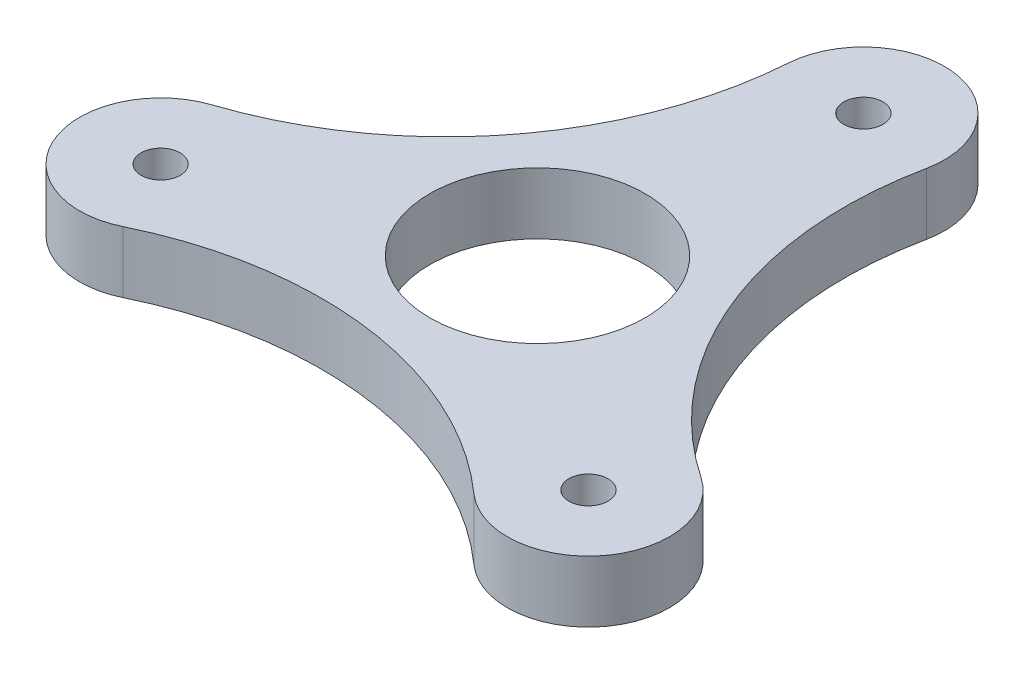
ISO-10303-21;
HEADER;
FILE_DESCRIPTION(('STEP AP214'),'2;1');
FILE_NAME('part.step','',(''),(''),'','','');
FILE_SCHEMA(('AUTOMOTIVE_DESIGN { 1 0 10303 214 1 1 1 1 }'));
ENDSEC;
DATA;
#1=APPLICATION_CONTEXT('core data for automotive mechanical design processes');
#2=APPLICATION_PROTOCOL_DEFINITION('international standard','automotive_design',2000,#1);
#3=PRODUCT_CONTEXT('',#1,'mechanical');
#4=PRODUCT('Part','Part','',(#3));
#5=PRODUCT_RELATED_PRODUCT_CATEGORY('part','',(#4));
#6=PRODUCT_DEFINITION_FORMATION('','',#4);
#7=PRODUCT_DEFINITION_CONTEXT('part definition',#1,'design');
#8=PRODUCT_DEFINITION('design','',#6,#7);
#9=PRODUCT_DEFINITION_SHAPE('','',#8);
#10=(LENGTH_UNIT() NAMED_UNIT(*) SI_UNIT(.MILLI.,.METRE.));
#11=(NAMED_UNIT(*) PLANE_ANGLE_UNIT() SI_UNIT($,.RADIAN.));
#12=(NAMED_UNIT(*) SI_UNIT($,.STERADIAN.) SOLID_ANGLE_UNIT());
#13=UNCERTAINTY_MEASURE_WITH_UNIT(LENGTH_MEASURE(1.E-05),#10,'distance_accuracy_value','');
#14=(GEOMETRIC_REPRESENTATION_CONTEXT(3) GLOBAL_UNCERTAINTY_ASSIGNED_CONTEXT((#13)) GLOBAL_UNIT_ASSIGNED_CONTEXT((#10,
#11,#12)) REPRESENTATION_CONTEXT('',''));
#15=CARTESIAN_POINT('',(0.,0.,0.));
#16=DIRECTION('',(0.,0.,1.));
#17=DIRECTION('',(1.,0.,0.));
#18=AXIS2_PLACEMENT_3D('',#15,#16,#17);
#19=CARTESIAN_POINT('',(493.86235827293,6.35,-1314.24921084591));
#20=DIRECTION('',(0.,1.,0.));
#21=DIRECTION('',(0.,0.,1.));
#22=AXIS2_PLACEMENT_3D('',#19,#20,#21);
#23=PLANE('',#22);
#24=CARTESIAN_POINT('',(536.53601557805,6.35,-1264.7338598442));
#25=DIRECTION('',(0.,1.,0.));
#26=DIRECTION('',(0.,0.,1.));
#27=AXIS2_PLACEMENT_3D('',#24,#25,#26);
#28=CIRCLE('',#27,2.0193000000007);
#29=CARTESIAN_POINT('',(536.53601557805,6.35,-1262.7145598442));
#30=VERTEX_POINT('',#29);
#31=EDGE_CURVE('E189',#30,#30,#28,.T.);
#32=ORIENTED_EDGE('',*,*,#31,.F.);
#33=EDGE_LOOP('',(#32));
#34=FACE_BOUND('',#33,.T.);
#35=CARTESIAN_POINT('',(517.039050419532,6.35,-1312.60911884723));
#36=DIRECTION('',(0.,1.,0.));
#37=DIRECTION('',(0.,0.,1.));
#38=AXIS2_PLACEMENT_3D('',#35,#36,#37);
#39=CIRCLE('',#38,2.01929999999819);
#40=CARTESIAN_POINT('',(517.039050419532,6.35,-1310.58981884723));
#41=VERTEX_POINT('',#40);
#42=EDGE_CURVE('E122',#41,#41,#39,.T.);
#43=ORIENTED_EDGE('',*,*,#42,.F.);
#44=EDGE_LOOP('',(#43));
#45=FACE_BOUND('',#44,.T.);
#46=CARTESIAN_POINT('',(470.685666126328,6.35,-1315.8893028446));
#47=DIRECTION('',(0.,-1.,0.));
#48=DIRECTION('',(0.,0.,1.));
#49=AXIS2_PLACEMENT_3D('',#46,#47,#48);
#50=CIRCLE('',#49,38.1);
#51=CARTESIAN_POINT('',(508.690627285009,6.35,-1313.19989262539));
#52=VERTEX_POINT('',#51);
#53=CARTESIAN_POINT('',(482.689500258394,6.35,-1279.72968495212));
#54=VERTEX_POINT('',#53);
#55=EDGE_CURVE('E129',#52,#54,#50,.T.);
#56=ORIENTED_EDGE('',*,*,#55,.T.);
#57=CARTESIAN_POINT('',(485.326342489404,6.35,-1271.78662222174));
#58=DIRECTION('',(0.,1.,0.));
#59=DIRECTION('',(0.,0.,1.));
#60=AXIS2_PLACEMENT_3D('',#57,#58,#59);
#61=CIRCLE('',#60,8.36930000000019);
#62=CARTESIAN_POINT('',(488.988928956896,6.35,-1264.26128881662));
#63=VERTEX_POINT('',#62);
#64=EDGE_CURVE('E87',#54,#63,#61,.T.);
#65=ORIENTED_EDGE('',*,*,#64,.T.);
#66=CARTESIAN_POINT('',(505.662311965204,6.35,-1230.00332187376));
#67=DIRECTION('',(0.,-1.,0.));
#68=DIRECTION('',(0.,0.,-1.));
#69=AXIS2_PLACEMENT_3D('',#66,#67,#68);
#70=CIRCLE('',#69,38.1);
#71=CARTESIAN_POINT('',(530.975542585193,6.35,-1258.47875612118));
#72=VERTEX_POINT('',#71);
#73=EDGE_CURVE('E100',#63,#72,#70,.T.);
#74=ORIENTED_EDGE('',*,*,#73,.T.);
#75=CARTESIAN_POINT('',(536.53601557805,6.35,-1264.7338598442));
#76=DIRECTION('',(0.,1.,0.));
#77=DIRECTION('',(0.,0.,1.));
#78=AXIS2_PLACEMENT_3D('',#75,#76,#77);
#79=CIRCLE('',#78,8.36929999999969);
#80=CARTESIAN_POINT('',(541.221852245082,6.35,-1271.66841947116));
#81=VERTEX_POINT('',#80);
#82=EDGE_CURVE('E94',#72,#81,#79,.T.);
#83=ORIENTED_EDGE('',*,*,#82,.T.);
#84=CARTESIAN_POINT('',(562.553430395455,6.35,-1303.23697619481));
#85=DIRECTION('',(0.,-1.,0.));
#86=DIRECTION('',(0.,0.,-1.));
#87=AXIS2_PLACEMENT_3D('',#84,#85,#86);
#88=CIRCLE('',#87,38.1);
#89=CARTESIAN_POINT('',(525.2363656434,6.35,-1310.92115983987));
#90=VERTEX_POINT('',#89);
#91=EDGE_CURVE('E98',#81,#90,#88,.T.);
#92=ORIENTED_EDGE('',*,*,#91,.T.);
#93=CARTESIAN_POINT('',(517.039050419532,6.35,-1312.60911884723));
#94=DIRECTION('',(0.,1.,0.));
#95=DIRECTION('',(0.,0.,1.));
#96=AXIS2_PLACEMENT_3D('',#93,#94,#95);
#97=CIRCLE('',#96,8.36929999999943);
#98=EDGE_CURVE('E50',#90,#52,#97,.T.);
#99=ORIENTED_EDGE('',*,*,#98,.T.);
#100=EDGE_LOOP('',(#56,#65,#74,#83,#92,#99));
#101=FACE_BOUND('',#100,.T.);
#102=CARTESIAN_POINT('',(512.967136162329,6.35,-1283.04320030439));
#103=DIRECTION('',(0.,1.,0.));
#104=DIRECTION('',(0.,0.,1.));
#105=AXIS2_PLACEMENT_3D('',#102,#103,#104);
#106=CIRCLE('',#105,11.1124999999999);
#107=CARTESIAN_POINT('',(512.967136162329,6.35,-1271.93070030439));
#108=VERTEX_POINT('',#107);
#109=EDGE_CURVE('E195',#108,#108,#106,.T.);
#110=ORIENTED_EDGE('',*,*,#109,.F.);
#111=EDGE_LOOP('',(#110));
#112=FACE_BOUND('',#111,.T.);
#113=CARTESIAN_POINT('',(485.326342489404,6.35,-1271.78662222174));
#114=DIRECTION('',(0.,1.,0.));
#115=DIRECTION('',(0.,0.,1.));
#116=AXIS2_PLACEMENT_3D('',#113,#114,#115);
#117=CIRCLE('',#116,2.01930000000017);
#118=CARTESIAN_POINT('',(485.326342489404,6.35,-1269.76732222174));
#119=VERTEX_POINT('',#118);
#120=EDGE_CURVE('E180',#119,#119,#117,.T.);
#121=ORIENTED_EDGE('',*,*,#120,.F.);
#122=EDGE_LOOP('',(#121));
#123=FACE_BOUND('',#122,.T.);
#124=ADVANCED_FACE('F33',(#34,#45,#101,#112,#123),#23,.T.);
#125=CARTESIAN_POINT('',(493.86235827293,0.,-1314.24921084591));
#126=DIRECTION('',(0.,1.,0.));
#127=DIRECTION('',(0.,0.,1.));
#128=AXIS2_PLACEMENT_3D('',#125,#126,#127);
#129=PLANE('',#128);
#130=CARTESIAN_POINT('',(470.685666126328,0.,-1315.8893028446));
#131=DIRECTION('',(0.,-1.,0.));
#132=DIRECTION('',(0.,0.,1.));
#133=AXIS2_PLACEMENT_3D('',#130,#131,#132);
#134=CIRCLE('',#133,38.1);
#135=CARTESIAN_POINT('',(508.690627285009,0.,-1313.19989262539));
#136=VERTEX_POINT('',#135);
#137=CARTESIAN_POINT('',(482.689500258394,0.,-1279.72968495212));
#138=VERTEX_POINT('',#137);
#139=EDGE_CURVE('E118',#136,#138,#134,.T.);
#140=ORIENTED_EDGE('',*,*,#139,.F.);
#141=CARTESIAN_POINT('',(517.039050419532,0.,-1312.60911884723));
#142=DIRECTION('',(0.,1.,0.));
#143=DIRECTION('',(0.,0.,1.));
#144=AXIS2_PLACEMENT_3D('',#141,#142,#143);
#145=CIRCLE('',#144,8.36929999999943);
#146=CARTESIAN_POINT('',(525.2363656434,0.,-1310.92115983987));
#147=VERTEX_POINT('',#146);
#148=EDGE_CURVE('E79',#147,#136,#145,.T.);
#149=ORIENTED_EDGE('',*,*,#148,.F.);
#150=CARTESIAN_POINT('',(562.553430395455,0.,-1303.23697619481));
#151=DIRECTION('',(0.,-1.,0.));
#152=DIRECTION('',(0.,0.,-1.));
#153=AXIS2_PLACEMENT_3D('',#150,#151,#152);
#154=CIRCLE('',#153,38.1);
#155=CARTESIAN_POINT('',(541.221852245082,0.,-1271.66841947116));
#156=VERTEX_POINT('',#155);
#157=EDGE_CURVE('E73',#156,#147,#154,.T.);
#158=ORIENTED_EDGE('',*,*,#157,.F.);
#159=CARTESIAN_POINT('',(536.53601557805,0.,-1264.7338598442));
#160=DIRECTION('',(0.,1.,0.));
#161=DIRECTION('',(0.,0.,1.));
#162=AXIS2_PLACEMENT_3D('',#159,#160,#161);
#163=CIRCLE('',#162,8.36929999999969);
#164=CARTESIAN_POINT('',(530.975542585193,0.,-1258.47875612118));
#165=VERTEX_POINT('',#164);
#166=EDGE_CURVE('E108',#165,#156,#163,.T.);
#167=ORIENTED_EDGE('',*,*,#166,.F.);
#168=CARTESIAN_POINT('',(505.662311965204,0.,-1230.00332187376));
#169=DIRECTION('',(0.,-1.,0.));
#170=DIRECTION('',(0.,0.,-1.));
#171=AXIS2_PLACEMENT_3D('',#168,#169,#170);
#172=CIRCLE('',#171,38.1);
#173=CARTESIAN_POINT('',(488.988928956896,0.,-1264.26128881662));
#174=VERTEX_POINT('',#173);
#175=EDGE_CURVE('E124',#174,#165,#172,.T.);
#176=ORIENTED_EDGE('',*,*,#175,.F.);
#177=CARTESIAN_POINT('',(485.326342489404,0.,-1271.78662222174));
#178=DIRECTION('',(0.,1.,0.));
#179=DIRECTION('',(0.,0.,1.));
#180=AXIS2_PLACEMENT_3D('',#177,#178,#179);
#181=CIRCLE('',#180,8.36930000000019);
#182=EDGE_CURVE('E121',#138,#174,#181,.T.);
#183=ORIENTED_EDGE('',*,*,#182,.F.);
#184=EDGE_LOOP('',(#140,#149,#158,#167,#176,#183));
#185=FACE_BOUND('',#184,.T.);
#186=CARTESIAN_POINT('',(517.039050419532,0.,-1312.60911884723));
#187=DIRECTION('',(0.,1.,0.));
#188=DIRECTION('',(0.,0.,1.));
#189=AXIS2_PLACEMENT_3D('',#186,#187,#188);
#190=CIRCLE('',#189,2.01929999999819);
#191=CARTESIAN_POINT('',(517.039050419532,0.,-1310.58981884723));
#192=VERTEX_POINT('',#191);
#193=EDGE_CURVE('E198',#192,#192,#190,.T.);
#194=ORIENTED_EDGE('',*,*,#193,.T.);
#195=EDGE_LOOP('',(#194));
#196=FACE_BOUND('',#195,.T.);
#197=CARTESIAN_POINT('',(512.967136162329,0.,-1283.04320030439));
#198=DIRECTION('',(0.,1.,0.));
#199=DIRECTION('',(0.,0.,1.));
#200=AXIS2_PLACEMENT_3D('',#197,#198,#199);
#201=CIRCLE('',#200,11.1124999999999);
#202=CARTESIAN_POINT('',(512.967136162329,0.,-1271.93070030439));
#203=VERTEX_POINT('',#202);
#204=EDGE_CURVE('E192',#203,#203,#201,.T.);
#205=ORIENTED_EDGE('',*,*,#204,.T.);
#206=EDGE_LOOP('',(#205));
#207=FACE_BOUND('',#206,.T.);
#208=CARTESIAN_POINT('',(536.53601557805,0.,-1264.7338598442));
#209=DIRECTION('',(0.,1.,0.));
#210=DIRECTION('',(0.,0.,1.));
#211=AXIS2_PLACEMENT_3D('',#208,#209,#210);
#212=CIRCLE('',#211,2.0193000000007);
#213=CARTESIAN_POINT('',(536.53601557805,0.,-1262.7145598442));
#214=VERTEX_POINT('',#213);
#215=EDGE_CURVE('E186',#214,#214,#212,.T.);
#216=ORIENTED_EDGE('',*,*,#215,.T.);
#217=EDGE_LOOP('',(#216));
#218=FACE_BOUND('',#217,.T.);
#219=CARTESIAN_POINT('',(485.326342489404,0.,-1271.78662222174));
#220=DIRECTION('',(0.,1.,0.));
#221=DIRECTION('',(0.,0.,1.));
#222=AXIS2_PLACEMENT_3D('',#219,#220,#221);
#223=CIRCLE('',#222,2.01930000000017);
#224=CARTESIAN_POINT('',(485.326342489404,0.,-1269.76732222174));
#225=VERTEX_POINT('',#224);
#226=EDGE_CURVE('E183',#225,#225,#223,.T.);
#227=ORIENTED_EDGE('',*,*,#226,.T.);
#228=EDGE_LOOP('',(#227));
#229=FACE_BOUND('',#228,.T.);
#230=ADVANCED_FACE('F138',(#185,#196,#207,#218,#229),#129,.F.);
#231=CARTESIAN_POINT('',(470.685666126328,6.35,-1315.8893028446));
#232=DIRECTION('',(0.,-1.,0.));
#233=DIRECTION('',(0.,0.,-1.));
#234=AXIS2_PLACEMENT_3D('',#231,#232,#233);
#235=CYLINDRICAL_SURFACE('',#234,38.1);
#236=ORIENTED_EDGE('',*,*,#139,.T.);
#237=DIRECTION('',(0.,-1.,0.));
#238=VECTOR('',#237,1.);
#239=CARTESIAN_POINT('',(482.689500258394,6.35,-1279.72968495212));
#240=LINE('',#239,#238);
#241=EDGE_CURVE('E11',#54,#138,#240,.T.);
#242=ORIENTED_EDGE('',*,*,#241,.F.);
#243=ORIENTED_EDGE('',*,*,#55,.F.);
#244=DIRECTION('',(0.,-1.,0.));
#245=VECTOR('',#244,1.);
#246=CARTESIAN_POINT('',(508.690627285009,6.35,-1313.19989262539));
#247=LINE('',#246,#245);
#248=EDGE_CURVE('E114',#52,#136,#247,.T.);
#249=ORIENTED_EDGE('',*,*,#248,.T.);
#250=EDGE_LOOP('',(#236,#242,#243,#249));
#251=FACE_BOUND('',#250,.T.);
#252=ADVANCED_FACE('F35',(#251),#235,.F.);
#253=CARTESIAN_POINT('',(485.326342489404,6.35,-1271.78662222174));
#254=DIRECTION('',(0.,-1.,0.));
#255=DIRECTION('',(0.,0.,-1.));
#256=AXIS2_PLACEMENT_3D('',#253,#254,#255);
#257=CYLINDRICAL_SURFACE('',#256,8.36930000000019);
#258=ORIENTED_EDGE('',*,*,#182,.T.);
#259=DIRECTION('',(0.,-1.,0.));
#260=VECTOR('',#259,1.);
#261=CARTESIAN_POINT('',(488.988928956896,6.35,-1264.26128881662));
#262=LINE('',#261,#260);
#263=EDGE_CURVE('E42',#63,#174,#262,.T.);
#264=ORIENTED_EDGE('',*,*,#263,.F.);
#265=ORIENTED_EDGE('',*,*,#64,.F.);
#266=ORIENTED_EDGE('',*,*,#241,.T.);
#267=EDGE_LOOP('',(#258,#264,#265,#266));
#268=FACE_BOUND('',#267,.T.);
#269=ADVANCED_FACE('F256',(#268),#257,.T.);
#270=CARTESIAN_POINT('',(505.662311965204,6.35,-1230.00332187376));
#271=DIRECTION('',(0.,-1.,0.));
#272=DIRECTION('',(0.,0.,-1.));
#273=AXIS2_PLACEMENT_3D('',#270,#271,#272);
#274=CYLINDRICAL_SURFACE('',#273,38.1);
#275=ORIENTED_EDGE('',*,*,#175,.T.);
#276=DIRECTION('',(0.,-1.,0.));
#277=VECTOR('',#276,1.);
#278=CARTESIAN_POINT('',(530.975542585193,6.35,-1258.47875612118));
#279=LINE('',#278,#277);
#280=EDGE_CURVE('E109',#72,#165,#279,.T.);
#281=ORIENTED_EDGE('',*,*,#280,.F.);
#282=ORIENTED_EDGE('',*,*,#73,.F.);
#283=ORIENTED_EDGE('',*,*,#263,.T.);
#284=EDGE_LOOP('',(#275,#281,#282,#283));
#285=FACE_BOUND('',#284,.T.);
#286=ADVANCED_FACE('F135',(#285),#274,.F.);
#287=CARTESIAN_POINT('',(536.53601557805,6.35,-1264.7338598442));
#288=DIRECTION('',(0.,-1.,0.));
#289=DIRECTION('',(0.,0.,-1.));
#290=AXIS2_PLACEMENT_3D('',#287,#288,#289);
#291=CYLINDRICAL_SURFACE('',#290,8.36929999999969);
#292=ORIENTED_EDGE('',*,*,#166,.T.);
#293=DIRECTION('',(0.,-1.,0.));
#294=VECTOR('',#293,1.);
#295=CARTESIAN_POINT('',(541.221852245082,6.35,-1271.66841947116));
#296=LINE('',#295,#294);
#297=EDGE_CURVE('E105',#81,#156,#296,.T.);
#298=ORIENTED_EDGE('',*,*,#297,.F.);
#299=ORIENTED_EDGE('',*,*,#82,.F.);
#300=ORIENTED_EDGE('',*,*,#280,.T.);
#301=EDGE_LOOP('',(#292,#298,#299,#300));
#302=FACE_BOUND('',#301,.T.);
#303=ADVANCED_FACE('F106',(#302),#291,.T.);
#304=CARTESIAN_POINT('',(562.553430395455,6.35,-1303.23697619481));
#305=DIRECTION('',(0.,-1.,0.));
#306=DIRECTION('',(0.,0.,-1.));
#307=AXIS2_PLACEMENT_3D('',#304,#305,#306);
#308=CYLINDRICAL_SURFACE('',#307,38.1);
#309=ORIENTED_EDGE('',*,*,#157,.T.);
#310=DIRECTION('',(0.,-1.,0.));
#311=VECTOR('',#310,1.);
#312=CARTESIAN_POINT('',(525.2363656434,6.35,-1310.92115983987));
#313=LINE('',#312,#311);
#314=EDGE_CURVE('E110',#90,#147,#313,.T.);
#315=ORIENTED_EDGE('',*,*,#314,.F.);
#316=ORIENTED_EDGE('',*,*,#91,.F.);
#317=ORIENTED_EDGE('',*,*,#297,.T.);
#318=EDGE_LOOP('',(#309,#315,#316,#317));
#319=FACE_BOUND('',#318,.T.);
#320=ADVANCED_FACE('F112',(#319),#308,.F.);
#321=CARTESIAN_POINT('',(517.039050419532,6.35,-1312.60911884723));
#322=DIRECTION('',(0.,-1.,0.));
#323=DIRECTION('',(0.,0.,-1.));
#324=AXIS2_PLACEMENT_3D('',#321,#322,#323);
#325=CYLINDRICAL_SURFACE('',#324,8.36929999999943);
#326=ORIENTED_EDGE('',*,*,#148,.T.);
#327=ORIENTED_EDGE('',*,*,#248,.F.);
#328=ORIENTED_EDGE('',*,*,#98,.F.);
#329=ORIENTED_EDGE('',*,*,#314,.T.);
#330=EDGE_LOOP('',(#326,#327,#328,#329));
#331=FACE_BOUND('',#330,.T.);
#332=ADVANCED_FACE('F143',(#331),#325,.T.);
#333=CARTESIAN_POINT('',(517.039050419532,6.35,-1312.60911884723));
#334=DIRECTION('',(0.,-1.,0.));
#335=DIRECTION('',(0.,0.,-1.));
#336=AXIS2_PLACEMENT_3D('',#333,#334,#335);
#337=CYLINDRICAL_SURFACE('',#336,2.01929999999819);
#338=ORIENTED_EDGE('',*,*,#42,.T.);
#339=EDGE_LOOP('',(#338));
#340=FACE_BOUND('',#339,.T.);
#341=ORIENTED_EDGE('',*,*,#193,.F.);
#342=EDGE_LOOP('',(#341));
#343=FACE_BOUND('',#342,.T.);
#344=ADVANCED_FACE('F145',(#340,#343),#337,.F.);
#345=CARTESIAN_POINT('',(512.967136162329,6.35,-1283.04320030439));
#346=DIRECTION('',(0.,-1.,0.));
#347=DIRECTION('',(0.,0.,-1.));
#348=AXIS2_PLACEMENT_3D('',#345,#346,#347);
#349=CYLINDRICAL_SURFACE('',#348,11.1124999999999);
#350=ORIENTED_EDGE('',*,*,#109,.T.);
#351=EDGE_LOOP('',(#350));
#352=FACE_BOUND('',#351,.T.);
#353=ORIENTED_EDGE('',*,*,#204,.F.);
#354=EDGE_LOOP('',(#353));
#355=FACE_BOUND('',#354,.T.);
#356=ADVANCED_FACE('F151',(#352,#355),#349,.F.);
#357=CARTESIAN_POINT('',(536.53601557805,6.35,-1264.7338598442));
#358=DIRECTION('',(0.,-1.,0.));
#359=DIRECTION('',(0.,0.,-1.));
#360=AXIS2_PLACEMENT_3D('',#357,#358,#359);
#361=CYLINDRICAL_SURFACE('',#360,2.0193000000007);
#362=ORIENTED_EDGE('',*,*,#31,.T.);
#363=EDGE_LOOP('',(#362));
#364=FACE_BOUND('',#363,.T.);
#365=ORIENTED_EDGE('',*,*,#215,.F.);
#366=EDGE_LOOP('',(#365));
#367=FACE_BOUND('',#366,.T.);
#368=ADVANCED_FACE('F167',(#364,#367),#361,.F.);
#369=CARTESIAN_POINT('',(485.326342489404,6.35,-1271.78662222174));
#370=DIRECTION('',(0.,-1.,0.));
#371=DIRECTION('',(0.,0.,-1.));
#372=AXIS2_PLACEMENT_3D('',#369,#370,#371);
#373=CYLINDRICAL_SURFACE('',#372,2.01930000000017);
#374=ORIENTED_EDGE('',*,*,#120,.T.);
#375=EDGE_LOOP('',(#374));
#376=FACE_BOUND('',#375,.T.);
#377=ORIENTED_EDGE('',*,*,#226,.F.);
#378=EDGE_LOOP('',(#377));
#379=FACE_BOUND('',#378,.T.);
#380=ADVANCED_FACE('F171',(#376,#379),#373,.F.);
#381=CLOSED_SHELL('',(#124,#230,#252,#269,#286,#303,#320,#332,#344,#356,#368,#380));
#382=MANIFOLD_SOLID_BREP('B2',#381);
#383=ADVANCED_BREP_SHAPE_REPRESENTATION('',(#18,#382),#14);
#384=SHAPE_DEFINITION_REPRESENTATION(#9,#383);
ENDSEC;
END-ISO-10303-21;
